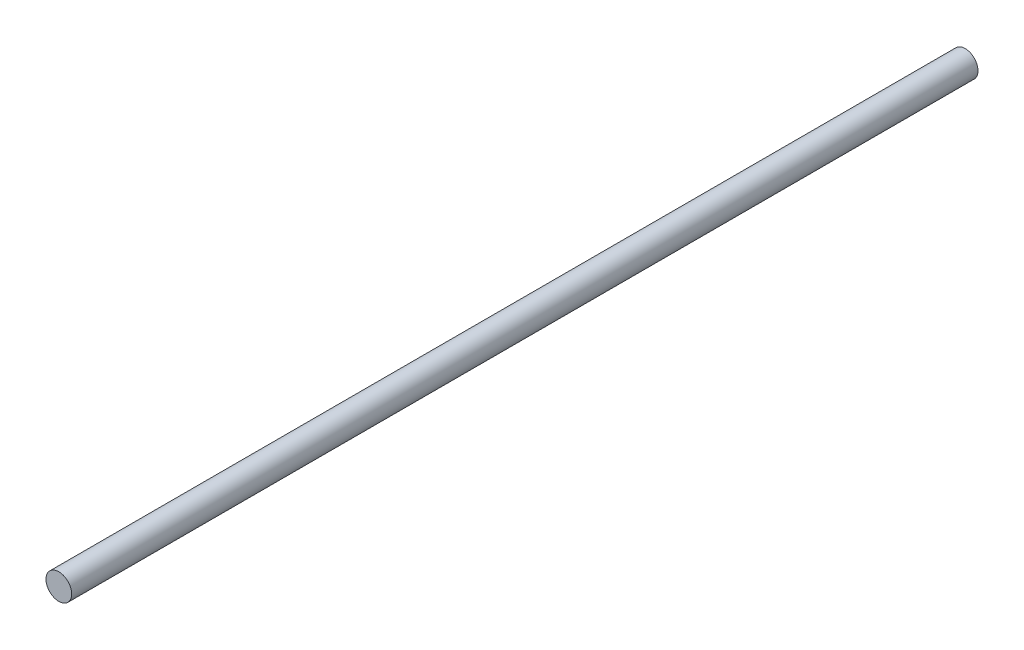
ISO-10303-21;
HEADER;
FILE_DESCRIPTION(('STEP AP214'),'2;1');
FILE_NAME('part.step','',(''),(''),'','','');
FILE_SCHEMA(('AUTOMOTIVE_DESIGN { 1 0 10303 214 1 1 1 1 }'));
ENDSEC;
DATA;
#1=APPLICATION_CONTEXT('core data for automotive mechanical design processes');
#2=APPLICATION_PROTOCOL_DEFINITION('international standard','automotive_design',2000,#1);
#3=PRODUCT_CONTEXT('',#1,'mechanical');
#4=PRODUCT('Part','Part','',(#3));
#5=PRODUCT_RELATED_PRODUCT_CATEGORY('part','',(#4));
#6=PRODUCT_DEFINITION_FORMATION('','',#4);
#7=PRODUCT_DEFINITION_CONTEXT('part definition',#1,'design');
#8=PRODUCT_DEFINITION('design','',#6,#7);
#9=PRODUCT_DEFINITION_SHAPE('','',#8);
#10=(LENGTH_UNIT() NAMED_UNIT(*) SI_UNIT(.MILLI.,.METRE.));
#11=(NAMED_UNIT(*) PLANE_ANGLE_UNIT() SI_UNIT($,.RADIAN.));
#12=(NAMED_UNIT(*) SI_UNIT($,.STERADIAN.) SOLID_ANGLE_UNIT());
#13=UNCERTAINTY_MEASURE_WITH_UNIT(LENGTH_MEASURE(1.E-05),#10,'distance_accuracy_value','');
#14=(GEOMETRIC_REPRESENTATION_CONTEXT(3) GLOBAL_UNCERTAINTY_ASSIGNED_CONTEXT((#13)) GLOBAL_UNIT_ASSIGNED_CONTEXT((#10,
#11,#12)) REPRESENTATION_CONTEXT('',''));
#15=CARTESIAN_POINT('',(0.,0.,0.));
#16=DIRECTION('',(0.,0.,1.));
#17=DIRECTION('',(1.,0.,0.));
#18=AXIS2_PLACEMENT_3D('',#15,#16,#17);
#19=CARTESIAN_POINT('',(0.,0.,282.));
#20=DIRECTION('',(0.,0.,-1.));
#21=DIRECTION('',(-1.,0.,0.));
#22=AXIS2_PLACEMENT_3D('',#19,#20,#21);
#23=CYLINDRICAL_SURFACE('',#22,4.);
#24=CARTESIAN_POINT('',(0.,0.,282.));
#25=DIRECTION('',(0.,0.,1.));
#26=DIRECTION('',(1.,0.,0.));
#27=AXIS2_PLACEMENT_3D('',#24,#25,#26);
#28=CIRCLE('',#27,4.);
#29=CARTESIAN_POINT('',(4.,0.,282.));
#30=VERTEX_POINT('',#29);
#31=EDGE_CURVE('E10',#30,#30,#28,.T.);
#32=ORIENTED_EDGE('',*,*,#31,.F.);
#33=EDGE_LOOP('',(#32));
#34=FACE_BOUND('',#33,.T.);
#35=CARTESIAN_POINT('',(0.,0.,0.));
#36=DIRECTION('',(0.,0.,1.));
#37=DIRECTION('',(1.,0.,0.));
#38=AXIS2_PLACEMENT_3D('',#35,#36,#37);
#39=CIRCLE('',#38,4.);
#40=CARTESIAN_POINT('',(4.,0.,0.));
#41=VERTEX_POINT('',#40);
#42=EDGE_CURVE('E34',#41,#41,#39,.T.);
#43=ORIENTED_EDGE('',*,*,#42,.T.);
#44=EDGE_LOOP('',(#43));
#45=FACE_BOUND('',#44,.T.);
#46=ADVANCED_FACE('F31',(#34,#45),#23,.T.);
#47=CARTESIAN_POINT('',(0.,0.,282.));
#48=DIRECTION('',(0.,0.,1.));
#49=DIRECTION('',(1.,0.,0.));
#50=AXIS2_PLACEMENT_3D('',#47,#48,#49);
#51=PLANE('',#50);
#52=ORIENTED_EDGE('',*,*,#31,.T.);
#53=EDGE_LOOP('',(#52));
#54=FACE_BOUND('',#53,.T.);
#55=ADVANCED_FACE('F46',(#54),#51,.T.);
#56=CARTESIAN_POINT('',(0.,0.,0.));
#57=DIRECTION('',(0.,0.,1.));
#58=DIRECTION('',(1.,0.,0.));
#59=AXIS2_PLACEMENT_3D('',#56,#57,#58);
#60=PLANE('',#59);
#61=ORIENTED_EDGE('',*,*,#42,.F.);
#62=EDGE_LOOP('',(#61));
#63=FACE_BOUND('',#62,.T.);
#64=ADVANCED_FACE('F44',(#63),#60,.F.);
#65=CLOSED_SHELL('',(#46,#55,#64));
#66=MANIFOLD_SOLID_BREP('B2',#65);
#67=ADVANCED_BREP_SHAPE_REPRESENTATION('',(#18,#66),#14);
#68=SHAPE_DEFINITION_REPRESENTATION(#9,#67);
ENDSEC;
END-ISO-10303-21;
